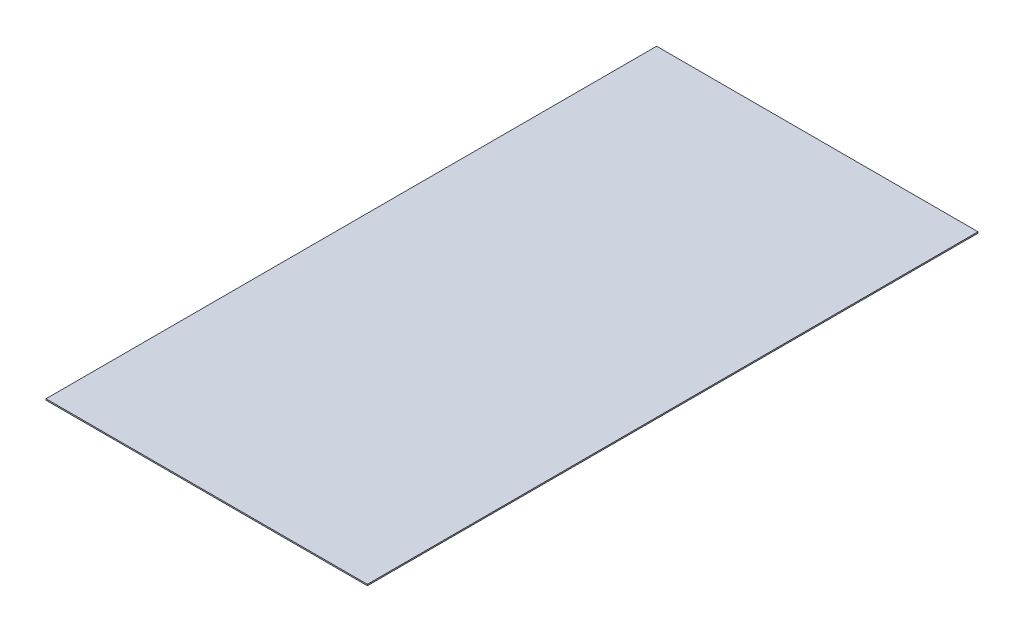
ISO-10303-21;
HEADER;
FILE_DESCRIPTION(('STEP AP214'),'2;1');
FILE_NAME('part.step','',(''),(''),'','','');
FILE_SCHEMA(('AUTOMOTIVE_DESIGN { 1 0 10303 214 1 1 1 1 }'));
ENDSEC;
DATA;
#1=APPLICATION_CONTEXT('core data for automotive mechanical design processes');
#2=APPLICATION_PROTOCOL_DEFINITION('international standard','automotive_design',2000,#1);
#3=PRODUCT_CONTEXT('',#1,'mechanical');
#4=PRODUCT('Part','Part','',(#3));
#5=PRODUCT_RELATED_PRODUCT_CATEGORY('part','',(#4));
#6=PRODUCT_DEFINITION_FORMATION('','',#4);
#7=PRODUCT_DEFINITION_CONTEXT('part definition',#1,'design');
#8=PRODUCT_DEFINITION('design','',#6,#7);
#9=PRODUCT_DEFINITION_SHAPE('','',#8);
#10=(LENGTH_UNIT() NAMED_UNIT(*) SI_UNIT(.MILLI.,.METRE.));
#11=(NAMED_UNIT(*) PLANE_ANGLE_UNIT() SI_UNIT($,.RADIAN.));
#12=(NAMED_UNIT(*) SI_UNIT($,.STERADIAN.) SOLID_ANGLE_UNIT());
#13=UNCERTAINTY_MEASURE_WITH_UNIT(LENGTH_MEASURE(1.E-05),#10,'distance_accuracy_value','');
#14=(GEOMETRIC_REPRESENTATION_CONTEXT(3) GLOBAL_UNCERTAINTY_ASSIGNED_CONTEXT((#13)) GLOBAL_UNIT_ASSIGNED_CONTEXT((#10,
#11,#12)) REPRESENTATION_CONTEXT('',''));
#15=CARTESIAN_POINT('',(0.,0.,0.));
#16=DIRECTION('',(0.,0.,1.));
#17=DIRECTION('',(1.,0.,0.));
#18=AXIS2_PLACEMENT_3D('',#15,#16,#17);
#19=CARTESIAN_POINT('',(0.,1.6,-760.));
#20=DIRECTION('',(1.,0.,0.));
#21=DIRECTION('',(0.,0.,-1.));
#22=AXIS2_PLACEMENT_3D('',#19,#20,#21);
#23=PLANE('',#22);
#24=DIRECTION('',(0.,0.,1.));
#25=VECTOR('',#24,1.);
#26=CARTESIAN_POINT('',(0.,0.,-760.));
#27=LINE('',#26,#25);
#28=CARTESIAN_POINT('',(0.,0.,-760.));
#29=VERTEX_POINT('',#28);
#30=CARTESIAN_POINT('',(0.,0.,0.));
#31=VERTEX_POINT('',#30);
#32=EDGE_CURVE('E102',#29,#31,#27,.T.);
#33=ORIENTED_EDGE('',*,*,#32,.T.);
#34=DIRECTION('',(0.,-1.,0.));
#35=VECTOR('',#34,1.);
#36=CARTESIAN_POINT('',(0.,1.6,0.));
#37=LINE('',#36,#35);
#38=CARTESIAN_POINT('',(0.,1.6,0.));
#39=VERTEX_POINT('',#38);
#40=EDGE_CURVE('E11',#39,#31,#37,.T.);
#41=ORIENTED_EDGE('',*,*,#40,.F.);
#42=DIRECTION('',(0.,0.,1.));
#43=VECTOR('',#42,1.);
#44=CARTESIAN_POINT('',(0.,1.6,-760.));
#45=LINE('',#44,#43);
#46=CARTESIAN_POINT('',(0.,1.6,-760.));
#47=VERTEX_POINT('',#46);
#48=EDGE_CURVE('E90',#47,#39,#45,.T.);
#49=ORIENTED_EDGE('',*,*,#48,.F.);
#50=DIRECTION('',(0.,-1.,0.));
#51=VECTOR('',#50,1.);
#52=CARTESIAN_POINT('',(0.,1.6,-760.));
#53=LINE('',#52,#51);
#54=EDGE_CURVE('E98',#47,#29,#53,.T.);
#55=ORIENTED_EDGE('',*,*,#54,.T.);
#56=EDGE_LOOP('',(#33,#41,#49,#55));
#57=FACE_BOUND('',#56,.T.);
#58=ADVANCED_FACE('F39',(#57),#23,.F.);
#59=CARTESIAN_POINT('',(0.,1.6,0.));
#60=DIRECTION('',(0.,0.,-1.));
#61=DIRECTION('',(-1.,0.,0.));
#62=AXIS2_PLACEMENT_3D('',#59,#60,#61);
#63=PLANE('',#62);
#64=DIRECTION('',(1.,0.,0.));
#65=VECTOR('',#64,1.);
#66=CARTESIAN_POINT('',(0.,0.,0.));
#67=LINE('',#66,#65);
#68=CARTESIAN_POINT('',(400.,0.,0.));
#69=VERTEX_POINT('',#68);
#70=EDGE_CURVE('E94',#31,#69,#67,.T.);
#71=ORIENTED_EDGE('',*,*,#70,.T.);
#72=DIRECTION('',(0.,-1.,0.));
#73=VECTOR('',#72,1.);
#74=CARTESIAN_POINT('',(400.,1.6,0.));
#75=LINE('',#74,#73);
#76=CARTESIAN_POINT('',(400.,1.6,0.));
#77=VERTEX_POINT('',#76);
#78=EDGE_CURVE('E47',#77,#69,#75,.T.);
#79=ORIENTED_EDGE('',*,*,#78,.F.);
#80=DIRECTION('',(1.,0.,0.));
#81=VECTOR('',#80,1.);
#82=CARTESIAN_POINT('',(0.,1.6,0.));
#83=LINE('',#82,#81);
#84=EDGE_CURVE('E85',#39,#77,#83,.T.);
#85=ORIENTED_EDGE('',*,*,#84,.F.);
#86=ORIENTED_EDGE('',*,*,#40,.T.);
#87=EDGE_LOOP('',(#71,#79,#85,#86));
#88=FACE_BOUND('',#87,.T.);
#89=ADVANCED_FACE('F93',(#88),#63,.F.);
#90=CARTESIAN_POINT('',(400.,1.6,0.));
#91=DIRECTION('',(-1.,0.,0.));
#92=DIRECTION('',(0.,0.,1.));
#93=AXIS2_PLACEMENT_3D('',#90,#91,#92);
#94=PLANE('',#93);
#95=DIRECTION('',(0.,0.,-1.));
#96=VECTOR('',#95,1.);
#97=CARTESIAN_POINT('',(400.,0.,0.));
#98=LINE('',#97,#96);
#99=CARTESIAN_POINT('',(400.,0.,-760.));
#100=VERTEX_POINT('',#99);
#101=EDGE_CURVE('E72',#69,#100,#98,.T.);
#102=ORIENTED_EDGE('',*,*,#101,.T.);
#103=DIRECTION('',(0.,-1.,0.));
#104=VECTOR('',#103,1.);
#105=CARTESIAN_POINT('',(400.,1.6,-760.));
#106=LINE('',#105,#104);
#107=CARTESIAN_POINT('',(400.,1.6,-760.));
#108=VERTEX_POINT('',#107);
#109=EDGE_CURVE('E95',#108,#100,#106,.T.);
#110=ORIENTED_EDGE('',*,*,#109,.F.);
#111=DIRECTION('',(0.,0.,-1.));
#112=VECTOR('',#111,1.);
#113=CARTESIAN_POINT('',(400.,1.6,0.));
#114=LINE('',#113,#112);
#115=EDGE_CURVE('E88',#77,#108,#114,.T.);
#116=ORIENTED_EDGE('',*,*,#115,.F.);
#117=ORIENTED_EDGE('',*,*,#78,.T.);
#118=EDGE_LOOP('',(#102,#110,#116,#117));
#119=FACE_BOUND('',#118,.T.);
#120=ADVANCED_FACE('F96',(#119),#94,.F.);
#121=CARTESIAN_POINT('',(400.,1.6,-760.));
#122=DIRECTION('',(0.,0.,1.));
#123=DIRECTION('',(1.,0.,0.));
#124=AXIS2_PLACEMENT_3D('',#121,#122,#123);
#125=PLANE('',#124);
#126=DIRECTION('',(-1.,0.,0.));
#127=VECTOR('',#126,1.);
#128=CARTESIAN_POINT('',(400.,0.,-760.));
#129=LINE('',#128,#127);
#130=EDGE_CURVE('E78',#100,#29,#129,.T.);
#131=ORIENTED_EDGE('',*,*,#130,.T.);
#132=ORIENTED_EDGE('',*,*,#54,.F.);
#133=DIRECTION('',(-1.,0.,0.));
#134=VECTOR('',#133,1.);
#135=CARTESIAN_POINT('',(400.,1.6,-760.));
#136=LINE('',#135,#134);
#137=EDGE_CURVE('E55',#108,#47,#136,.T.);
#138=ORIENTED_EDGE('',*,*,#137,.F.);
#139=ORIENTED_EDGE('',*,*,#109,.T.);
#140=EDGE_LOOP('',(#131,#132,#138,#139));
#141=FACE_BOUND('',#140,.T.);
#142=ADVANCED_FACE('F109',(#141),#125,.F.);
#143=CARTESIAN_POINT('',(0.,1.6,0.));
#144=DIRECTION('',(0.,1.,0.));
#145=DIRECTION('',(0.,0.,1.));
#146=AXIS2_PLACEMENT_3D('',#143,#144,#145);
#147=PLANE('',#146);
#148=ORIENTED_EDGE('',*,*,#48,.T.);
#149=ORIENTED_EDGE('',*,*,#84,.T.);
#150=ORIENTED_EDGE('',*,*,#115,.T.);
#151=ORIENTED_EDGE('',*,*,#137,.T.);
#152=EDGE_LOOP('',(#148,#149,#150,#151));
#153=FACE_BOUND('',#152,.T.);
#154=ADVANCED_FACE('F86',(#153),#147,.T.);
#155=CARTESIAN_POINT('',(0.,0.,0.));
#156=DIRECTION('',(0.,1.,0.));
#157=DIRECTION('',(0.,0.,1.));
#158=AXIS2_PLACEMENT_3D('',#155,#156,#157);
#159=PLANE('',#158);
#160=ORIENTED_EDGE('',*,*,#32,.F.);
#161=ORIENTED_EDGE('',*,*,#130,.F.);
#162=ORIENTED_EDGE('',*,*,#101,.F.);
#163=ORIENTED_EDGE('',*,*,#70,.F.);
#164=EDGE_LOOP('',(#160,#161,#162,#163));
#165=FACE_BOUND('',#164,.T.);
#166=ADVANCED_FACE('F112',(#165),#159,.F.);
#167=CLOSED_SHELL('',(#58,#89,#120,#142,#154,#166));
#168=MANIFOLD_SOLID_BREP('B2',#167);
#169=ADVANCED_BREP_SHAPE_REPRESENTATION('',(#18,#168),#14);
#170=SHAPE_DEFINITION_REPRESENTATION(#9,#169);
ENDSEC;
END-ISO-10303-21;
